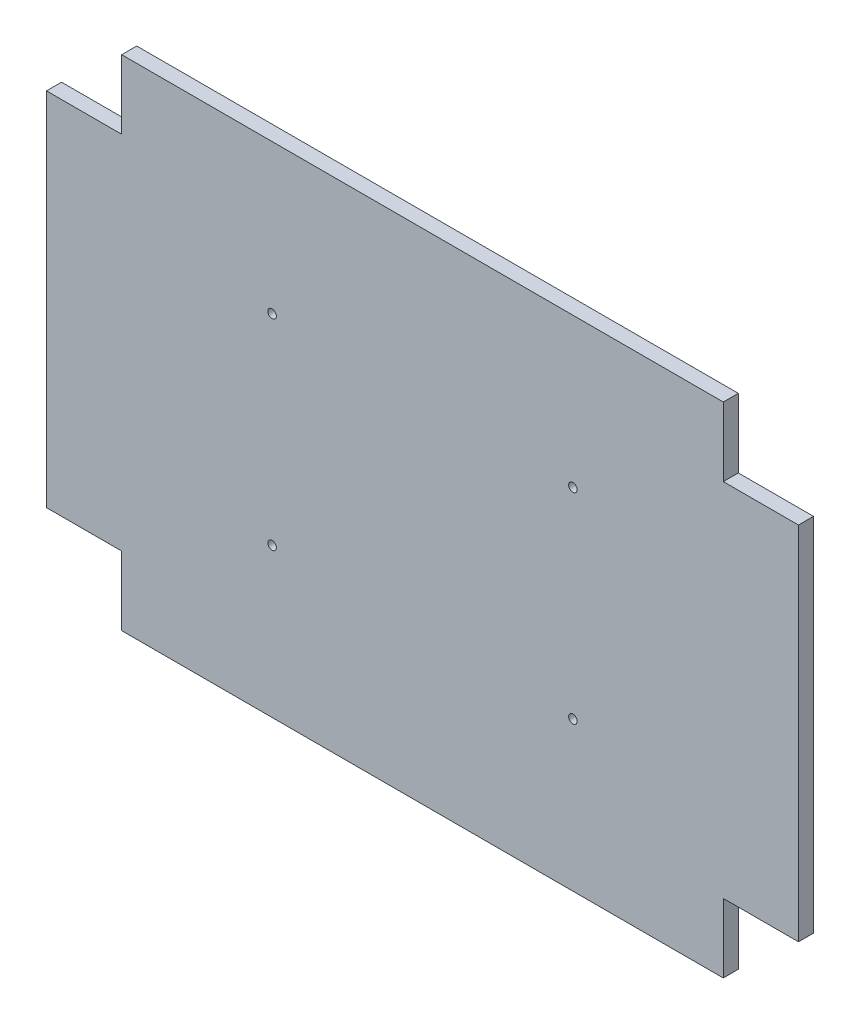
ISO-10303-21;
HEADER;
FILE_DESCRIPTION(('STEP AP214'),'2;1');
FILE_NAME('part.step','',(''),(''),'','','');
FILE_SCHEMA(('AUTOMOTIVE_DESIGN { 1 0 10303 214 1 1 1 1 }'));
ENDSEC;
DATA;
#1=APPLICATION_CONTEXT('core data for automotive mechanical design processes');
#2=APPLICATION_PROTOCOL_DEFINITION('international standard','automotive_design',2000,#1);
#3=PRODUCT_CONTEXT('',#1,'mechanical');
#4=PRODUCT('Part','Part','',(#3));
#5=PRODUCT_RELATED_PRODUCT_CATEGORY('part','',(#4));
#6=PRODUCT_DEFINITION_FORMATION('','',#4);
#7=PRODUCT_DEFINITION_CONTEXT('part definition',#1,'design');
#8=PRODUCT_DEFINITION('design','',#6,#7);
#9=PRODUCT_DEFINITION_SHAPE('','',#8);
#10=(LENGTH_UNIT() NAMED_UNIT(*) SI_UNIT(.MILLI.,.METRE.));
#11=(NAMED_UNIT(*) PLANE_ANGLE_UNIT() SI_UNIT($,.RADIAN.));
#12=(NAMED_UNIT(*) SI_UNIT($,.STERADIAN.) SOLID_ANGLE_UNIT());
#13=UNCERTAINTY_MEASURE_WITH_UNIT(LENGTH_MEASURE(1.E-05),#10,'distance_accuracy_value','');
#14=(GEOMETRIC_REPRESENTATION_CONTEXT(3) GLOBAL_UNCERTAINTY_ASSIGNED_CONTEXT((#13)) GLOBAL_UNIT_ASSIGNED_CONTEXT((#10,
#11,#12)) REPRESENTATION_CONTEXT('',''));
#15=CARTESIAN_POINT('',(0.,0.,0.));
#16=DIRECTION('',(0.,0.,1.));
#17=DIRECTION('',(1.,0.,0.));
#18=AXIS2_PLACEMENT_3D('',#15,#16,#17);
#19=CARTESIAN_POINT('',(-120.,99.5,6.));
#20=DIRECTION('',(1.,0.,0.));
#21=DIRECTION('',(0.,0.,-1.));
#22=AXIS2_PLACEMENT_3D('',#19,#20,#21);
#23=PLANE('',#22);
#24=DIRECTION('',(0.,-1.,0.));
#25=VECTOR('',#24,1.);
#26=CARTESIAN_POINT('',(-120.,99.5,0.));
#27=LINE('',#26,#25);
#28=CARTESIAN_POINT('',(-120.,99.5,0.));
#29=VERTEX_POINT('',#28);
#30=CARTESIAN_POINT('',(-120.,72.,0.));
#31=VERTEX_POINT('',#30);
#32=EDGE_CURVE('E153',#29,#31,#27,.T.);
#33=ORIENTED_EDGE('',*,*,#32,.T.);
#34=DIRECTION('',(0.,0.,-1.));
#35=VECTOR('',#34,1.);
#36=CARTESIAN_POINT('',(-120.,72.,6.));
#37=LINE('',#36,#35);
#38=CARTESIAN_POINT('',(-120.,72.,6.));
#39=VERTEX_POINT('',#38);
#40=EDGE_CURVE('E11',#39,#31,#37,.T.);
#41=ORIENTED_EDGE('',*,*,#40,.F.);
#42=DIRECTION('',(0.,-1.,0.));
#43=VECTOR('',#42,1.);
#44=CARTESIAN_POINT('',(-120.,99.5,6.));
#45=LINE('',#44,#43);
#46=CARTESIAN_POINT('',(-120.,99.5,6.));
#47=VERTEX_POINT('',#46);
#48=EDGE_CURVE('E176',#47,#39,#45,.T.);
#49=ORIENTED_EDGE('',*,*,#48,.F.);
#50=DIRECTION('',(0.,0.,-1.));
#51=VECTOR('',#50,1.);
#52=CARTESIAN_POINT('',(-120.,99.5,6.));
#53=LINE('',#52,#51);
#54=EDGE_CURVE('E149',#47,#29,#53,.T.);
#55=ORIENTED_EDGE('',*,*,#54,.T.);
#56=EDGE_LOOP('',(#33,#41,#49,#55));
#57=FACE_BOUND('',#56,.T.);
#58=ADVANCED_FACE('F33',(#57),#23,.F.);
#59=CARTESIAN_POINT('',(-150.,72.,6.));
#60=DIRECTION('',(0.,-1.,0.));
#61=DIRECTION('',(1.,0.,0.));
#62=AXIS2_PLACEMENT_3D('',#59,#60,#61);
#63=PLANE('',#62);
#64=DIRECTION('',(-1.,0.,0.));
#65=VECTOR('',#64,1.);
#66=CARTESIAN_POINT('',(-150.,72.,0.));
#67=LINE('',#66,#65);
#68=CARTESIAN_POINT('',(-150.,72.,0.));
#69=VERTEX_POINT('',#68);
#70=EDGE_CURVE('E156',#31,#69,#67,.T.);
#71=ORIENTED_EDGE('',*,*,#70,.T.);
#72=DIRECTION('',(0.,0.,-1.));
#73=VECTOR('',#72,1.);
#74=CARTESIAN_POINT('',(-150.,72.,6.));
#75=LINE('',#74,#73);
#76=CARTESIAN_POINT('',(-150.,72.,6.));
#77=VERTEX_POINT('',#76);
#78=EDGE_CURVE('E41',#77,#69,#75,.T.);
#79=ORIENTED_EDGE('',*,*,#78,.F.);
#80=DIRECTION('',(-1.,0.,0.));
#81=VECTOR('',#80,1.);
#82=CARTESIAN_POINT('',(-150.,72.,6.));
#83=LINE('',#82,#81);
#84=EDGE_CURVE('E104',#39,#77,#83,.T.);
#85=ORIENTED_EDGE('',*,*,#84,.F.);
#86=ORIENTED_EDGE('',*,*,#40,.T.);
#87=EDGE_LOOP('',(#71,#79,#85,#86));
#88=FACE_BOUND('',#87,.T.);
#89=ADVANCED_FACE('F255',(#88),#63,.F.);
#90=CARTESIAN_POINT('',(-150.,-72.,6.));
#91=DIRECTION('',(1.,0.,0.));
#92=DIRECTION('',(0.,0.,-1.));
#93=AXIS2_PLACEMENT_3D('',#90,#91,#92);
#94=PLANE('',#93);
#95=DIRECTION('',(0.,-1.,0.));
#96=VECTOR('',#95,1.);
#97=CARTESIAN_POINT('',(-150.,-72.,0.));
#98=LINE('',#97,#96);
#99=CARTESIAN_POINT('',(-150.,-72.,0.));
#100=VERTEX_POINT('',#99);
#101=EDGE_CURVE('E159',#69,#100,#98,.T.);
#102=ORIENTED_EDGE('',*,*,#101,.T.);
#103=DIRECTION('',(0.,0.,-1.));
#104=VECTOR('',#103,1.);
#105=CARTESIAN_POINT('',(-150.,-72.,6.));
#106=LINE('',#105,#104);
#107=CARTESIAN_POINT('',(-150.,-72.,6.));
#108=VERTEX_POINT('',#107);
#109=EDGE_CURVE('E195',#108,#100,#106,.T.);
#110=ORIENTED_EDGE('',*,*,#109,.F.);
#111=DIRECTION('',(0.,-1.,0.));
#112=VECTOR('',#111,1.);
#113=CARTESIAN_POINT('',(-150.,-72.,6.));
#114=LINE('',#113,#112);
#115=EDGE_CURVE('E203',#77,#108,#114,.T.);
#116=ORIENTED_EDGE('',*,*,#115,.F.);
#117=ORIENTED_EDGE('',*,*,#78,.T.);
#118=EDGE_LOOP('',(#102,#110,#116,#117));
#119=FACE_BOUND('',#118,.T.);
#120=ADVANCED_FACE('F201',(#119),#94,.F.);
#121=CARTESIAN_POINT('',(-150.,-72.,6.));
#122=DIRECTION('',(0.,1.,0.));
#123=DIRECTION('',(-1.,0.,0.));
#124=AXIS2_PLACEMENT_3D('',#121,#122,#123);
#125=PLANE('',#124);
#126=DIRECTION('',(1.,0.,0.));
#127=VECTOR('',#126,1.);
#128=CARTESIAN_POINT('',(-150.,-72.,0.));
#129=LINE('',#128,#127);
#130=CARTESIAN_POINT('',(-120.,-72.,0.));
#131=VERTEX_POINT('',#130);
#132=EDGE_CURVE('E161',#100,#131,#129,.T.);
#133=ORIENTED_EDGE('',*,*,#132,.T.);
#134=DIRECTION('',(0.,0.,-1.));
#135=VECTOR('',#134,1.);
#136=CARTESIAN_POINT('',(-120.,-72.,6.));
#137=LINE('',#136,#135);
#138=CARTESIAN_POINT('',(-120.,-72.,6.));
#139=VERTEX_POINT('',#138);
#140=EDGE_CURVE('E192',#139,#131,#137,.T.);
#141=ORIENTED_EDGE('',*,*,#140,.F.);
#142=DIRECTION('',(1.,0.,0.));
#143=VECTOR('',#142,1.);
#144=CARTESIAN_POINT('',(-150.,-72.,6.));
#145=LINE('',#144,#143);
#146=EDGE_CURVE('E221',#108,#139,#145,.T.);
#147=ORIENTED_EDGE('',*,*,#146,.F.);
#148=ORIENTED_EDGE('',*,*,#109,.T.);
#149=EDGE_LOOP('',(#133,#141,#147,#148));
#150=FACE_BOUND('',#149,.T.);
#151=ADVANCED_FACE('F212',(#150),#125,.F.);
#152=CARTESIAN_POINT('',(-120.,-99.5,6.));
#153=DIRECTION('',(1.,0.,0.));
#154=DIRECTION('',(0.,1.,0.));
#155=AXIS2_PLACEMENT_3D('',#152,#153,#154);
#156=PLANE('',#155);
#157=DIRECTION('',(0.,-1.,0.));
#158=VECTOR('',#157,1.);
#159=CARTESIAN_POINT('',(-120.,-99.5,0.));
#160=LINE('',#159,#158);
#161=CARTESIAN_POINT('',(-120.,-99.5,0.));
#162=VERTEX_POINT('',#161);
#163=EDGE_CURVE('E163',#131,#162,#160,.T.);
#164=ORIENTED_EDGE('',*,*,#163,.T.);
#165=DIRECTION('',(0.,0.,-1.));
#166=VECTOR('',#165,1.);
#167=CARTESIAN_POINT('',(-120.,-99.5,6.));
#168=LINE('',#167,#166);
#169=CARTESIAN_POINT('',(-120.,-99.5,6.));
#170=VERTEX_POINT('',#169);
#171=EDGE_CURVE('E189',#170,#162,#168,.T.);
#172=ORIENTED_EDGE('',*,*,#171,.F.);
#173=DIRECTION('',(0.,-1.,0.));
#174=VECTOR('',#173,1.);
#175=CARTESIAN_POINT('',(-120.,-99.5,6.));
#176=LINE('',#175,#174);
#177=EDGE_CURVE('E218',#139,#170,#176,.T.);
#178=ORIENTED_EDGE('',*,*,#177,.F.);
#179=ORIENTED_EDGE('',*,*,#140,.T.);
#180=EDGE_LOOP('',(#164,#172,#178,#179));
#181=FACE_BOUND('',#180,.T.);
#182=ADVANCED_FACE('F216',(#181),#156,.F.);
#183=CARTESIAN_POINT('',(-120.,-99.5,6.));
#184=DIRECTION('',(0.,1.,0.));
#185=DIRECTION('',(0.,0.,1.));
#186=AXIS2_PLACEMENT_3D('',#183,#184,#185);
#187=PLANE('',#186);
#188=DIRECTION('',(1.,0.,0.));
#189=VECTOR('',#188,1.);
#190=CARTESIAN_POINT('',(-120.,-99.5,0.));
#191=LINE('',#190,#189);
#192=CARTESIAN_POINT('',(120.,-99.5,0.));
#193=VERTEX_POINT('',#192);
#194=EDGE_CURVE('E165',#162,#193,#191,.T.);
#195=ORIENTED_EDGE('',*,*,#194,.T.);
#196=DIRECTION('',(0.,0.,-1.));
#197=VECTOR('',#196,1.);
#198=CARTESIAN_POINT('',(120.,-99.5,6.));
#199=LINE('',#198,#197);
#200=CARTESIAN_POINT('',(120.,-99.5,6.));
#201=VERTEX_POINT('',#200);
#202=EDGE_CURVE('E186',#201,#193,#199,.T.);
#203=ORIENTED_EDGE('',*,*,#202,.F.);
#204=DIRECTION('',(1.,0.,0.));
#205=VECTOR('',#204,1.);
#206=CARTESIAN_POINT('',(-120.,-99.5,6.));
#207=LINE('',#206,#205);
#208=EDGE_CURVE('E220',#170,#201,#207,.T.);
#209=ORIENTED_EDGE('',*,*,#208,.F.);
#210=ORIENTED_EDGE('',*,*,#171,.T.);
#211=EDGE_LOOP('',(#195,#203,#209,#210));
#212=FACE_BOUND('',#211,.T.);
#213=ADVANCED_FACE('F268',(#212),#187,.F.);
#214=CARTESIAN_POINT('',(120.,-99.5,6.));
#215=DIRECTION('',(-1.,0.,0.));
#216=DIRECTION('',(0.,0.,1.));
#217=AXIS2_PLACEMENT_3D('',#214,#215,#216);
#218=PLANE('',#217);
#219=DIRECTION('',(0.,1.,0.));
#220=VECTOR('',#219,1.);
#221=CARTESIAN_POINT('',(120.,-99.5,0.));
#222=LINE('',#221,#220);
#223=CARTESIAN_POINT('',(120.,-72.0000000000001,0.));
#224=VERTEX_POINT('',#223);
#225=EDGE_CURVE('E167',#193,#224,#222,.T.);
#226=ORIENTED_EDGE('',*,*,#225,.T.);
#227=DIRECTION('',(0.,0.,-1.));
#228=VECTOR('',#227,1.);
#229=CARTESIAN_POINT('',(120.,-72.0000000000001,6.));
#230=LINE('',#229,#228);
#231=CARTESIAN_POINT('',(120.,-72.0000000000001,6.));
#232=VERTEX_POINT('',#231);
#233=EDGE_CURVE('E183',#232,#224,#230,.T.);
#234=ORIENTED_EDGE('',*,*,#233,.F.);
#235=DIRECTION('',(0.,1.,0.));
#236=VECTOR('',#235,1.);
#237=CARTESIAN_POINT('',(120.,-99.5,6.));
#238=LINE('',#237,#236);
#239=EDGE_CURVE('E223',#201,#232,#238,.T.);
#240=ORIENTED_EDGE('',*,*,#239,.F.);
#241=ORIENTED_EDGE('',*,*,#202,.T.);
#242=EDGE_LOOP('',(#226,#234,#240,#241));
#243=FACE_BOUND('',#242,.T.);
#244=ADVANCED_FACE('F271',(#243),#218,.F.);
#245=CARTESIAN_POINT('',(150.,-72.0000000000001,6.));
#246=DIRECTION('',(0.,1.,0.));
#247=DIRECTION('',(0.,0.,1.));
#248=AXIS2_PLACEMENT_3D('',#245,#246,#247);
#249=PLANE('',#248);
#250=DIRECTION('',(1.,0.,0.));
#251=VECTOR('',#250,1.);
#252=CARTESIAN_POINT('',(150.,-72.0000000000001,0.));
#253=LINE('',#252,#251);
#254=CARTESIAN_POINT('',(150.,-72.0000000000001,0.));
#255=VERTEX_POINT('',#254);
#256=EDGE_CURVE('E169',#224,#255,#253,.T.);
#257=ORIENTED_EDGE('',*,*,#256,.T.);
#258=DIRECTION('',(0.,0.,-1.));
#259=VECTOR('',#258,1.);
#260=CARTESIAN_POINT('',(150.,-72.0000000000001,6.));
#261=LINE('',#260,#259);
#262=CARTESIAN_POINT('',(150.,-72.0000000000001,6.));
#263=VERTEX_POINT('',#262);
#264=EDGE_CURVE('E180',#263,#255,#261,.T.);
#265=ORIENTED_EDGE('',*,*,#264,.F.);
#266=DIRECTION('',(1.,0.,0.));
#267=VECTOR('',#266,1.);
#268=CARTESIAN_POINT('',(150.,-72.0000000000001,6.));
#269=LINE('',#268,#267);
#270=EDGE_CURVE('E229',#232,#263,#269,.T.);
#271=ORIENTED_EDGE('',*,*,#270,.F.);
#272=ORIENTED_EDGE('',*,*,#233,.T.);
#273=EDGE_LOOP('',(#257,#265,#271,#272));
#274=FACE_BOUND('',#273,.T.);
#275=ADVANCED_FACE('F235',(#274),#249,.F.);
#276=CARTESIAN_POINT('',(150.,-72.0000000000001,6.));
#277=DIRECTION('',(-1.,0.,0.));
#278=DIRECTION('',(0.,0.,1.));
#279=AXIS2_PLACEMENT_3D('',#276,#277,#278);
#280=PLANE('',#279);
#281=DIRECTION('',(0.,1.,0.));
#282=VECTOR('',#281,1.);
#283=CARTESIAN_POINT('',(150.,-72.0000000000001,0.));
#284=LINE('',#283,#282);
#285=CARTESIAN_POINT('',(150.,72.,0.));
#286=VERTEX_POINT('',#285);
#287=EDGE_CURVE('E171',#255,#286,#284,.T.);
#288=ORIENTED_EDGE('',*,*,#287,.T.);
#289=DIRECTION('',(0.,0.,-1.));
#290=VECTOR('',#289,1.);
#291=CARTESIAN_POINT('',(150.,72.,6.));
#292=LINE('',#291,#290);
#293=CARTESIAN_POINT('',(150.,72.,6.));
#294=VERTEX_POINT('',#293);
#295=EDGE_CURVE('E144',#294,#286,#292,.T.);
#296=ORIENTED_EDGE('',*,*,#295,.F.);
#297=DIRECTION('',(0.,1.,0.));
#298=VECTOR('',#297,1.);
#299=CARTESIAN_POINT('',(150.,-72.0000000000001,6.));
#300=LINE('',#299,#298);
#301=EDGE_CURVE('E135',#263,#294,#300,.T.);
#302=ORIENTED_EDGE('',*,*,#301,.F.);
#303=ORIENTED_EDGE('',*,*,#264,.T.);
#304=EDGE_LOOP('',(#288,#296,#302,#303));
#305=FACE_BOUND('',#304,.T.);
#306=ADVANCED_FACE('F239',(#305),#280,.F.);
#307=CARTESIAN_POINT('',(120.,72.,6.));
#308=DIRECTION('',(0.,-1.,0.));
#309=DIRECTION('',(1.,0.,0.));
#310=AXIS2_PLACEMENT_3D('',#307,#308,#309);
#311=PLANE('',#310);
#312=DIRECTION('',(-1.,0.,0.));
#313=VECTOR('',#312,1.);
#314=CARTESIAN_POINT('',(120.,72.,0.));
#315=LINE('',#314,#313);
#316=CARTESIAN_POINT('',(120.,72.,0.));
#317=VERTEX_POINT('',#316);
#318=EDGE_CURVE('E143',#286,#317,#315,.T.);
#319=ORIENTED_EDGE('',*,*,#318,.T.);
#320=DIRECTION('',(0.,0.,-1.));
#321=VECTOR('',#320,1.);
#322=CARTESIAN_POINT('',(120.,72.,6.));
#323=LINE('',#322,#321);
#324=CARTESIAN_POINT('',(120.,72.,6.));
#325=VERTEX_POINT('',#324);
#326=EDGE_CURVE('E140',#325,#317,#323,.T.);
#327=ORIENTED_EDGE('',*,*,#326,.F.);
#328=DIRECTION('',(-1.,0.,0.));
#329=VECTOR('',#328,1.);
#330=CARTESIAN_POINT('',(120.,72.,6.));
#331=LINE('',#330,#329);
#332=EDGE_CURVE('E129',#294,#325,#331,.T.);
#333=ORIENTED_EDGE('',*,*,#332,.F.);
#334=ORIENTED_EDGE('',*,*,#295,.T.);
#335=EDGE_LOOP('',(#319,#327,#333,#334));
#336=FACE_BOUND('',#335,.T.);
#337=ADVANCED_FACE('F141',(#336),#311,.F.);
#338=CARTESIAN_POINT('',(120.,99.5,6.));
#339=DIRECTION('',(-1.,0.,0.));
#340=DIRECTION('',(0.,-1.,0.));
#341=AXIS2_PLACEMENT_3D('',#338,#339,#340);
#342=PLANE('',#341);
#343=DIRECTION('',(0.,1.,0.));
#344=VECTOR('',#343,1.);
#345=CARTESIAN_POINT('',(120.,99.5,0.));
#346=LINE('',#345,#344);
#347=CARTESIAN_POINT('',(120.,99.5,0.));
#348=VERTEX_POINT('',#347);
#349=EDGE_CURVE('E90',#317,#348,#346,.T.);
#350=ORIENTED_EDGE('',*,*,#349,.T.);
#351=DIRECTION('',(0.,0.,-1.));
#352=VECTOR('',#351,1.);
#353=CARTESIAN_POINT('',(120.,99.5,6.));
#354=LINE('',#353,#352);
#355=CARTESIAN_POINT('',(120.,99.5,6.));
#356=VERTEX_POINT('',#355);
#357=EDGE_CURVE('E145',#356,#348,#354,.T.);
#358=ORIENTED_EDGE('',*,*,#357,.F.);
#359=DIRECTION('',(0.,1.,0.));
#360=VECTOR('',#359,1.);
#361=CARTESIAN_POINT('',(120.,99.5,6.));
#362=LINE('',#361,#360);
#363=EDGE_CURVE('E133',#325,#356,#362,.T.);
#364=ORIENTED_EDGE('',*,*,#363,.F.);
#365=ORIENTED_EDGE('',*,*,#326,.T.);
#366=EDGE_LOOP('',(#350,#358,#364,#365));
#367=FACE_BOUND('',#366,.T.);
#368=ADVANCED_FACE('F147',(#367),#342,.F.);
#369=CARTESIAN_POINT('',(-120.,99.5,6.));
#370=DIRECTION('',(0.,-1.,0.));
#371=DIRECTION('',(0.,0.,-1.));
#372=AXIS2_PLACEMENT_3D('',#369,#370,#371);
#373=PLANE('',#372);
#374=DIRECTION('',(-1.,0.,0.));
#375=VECTOR('',#374,1.);
#376=CARTESIAN_POINT('',(-120.,99.5,0.));
#377=LINE('',#376,#375);
#378=EDGE_CURVE('E96',#348,#29,#377,.T.);
#379=ORIENTED_EDGE('',*,*,#378,.T.);
#380=ORIENTED_EDGE('',*,*,#54,.F.);
#381=DIRECTION('',(-1.,0.,0.));
#382=VECTOR('',#381,1.);
#383=CARTESIAN_POINT('',(-120.,99.5,6.));
#384=LINE('',#383,#382);
#385=EDGE_CURVE('E49',#356,#47,#384,.T.);
#386=ORIENTED_EDGE('',*,*,#385,.F.);
#387=ORIENTED_EDGE('',*,*,#357,.T.);
#388=EDGE_LOOP('',(#379,#380,#386,#387));
#389=FACE_BOUND('',#388,.T.);
#390=ADVANCED_FACE('F243',(#389),#373,.F.);
#391=CARTESIAN_POINT('',(0.,0.,6.));
#392=DIRECTION('',(0.,0.,1.));
#393=DIRECTION('',(1.,0.,0.));
#394=AXIS2_PLACEMENT_3D('',#391,#392,#393);
#395=PLANE('',#394);
#396=CARTESIAN_POINT('',(-60.,40.,6.));
#397=DIRECTION('',(0.,0.,1.));
#398=DIRECTION('',(1.,0.,0.));
#399=AXIS2_PLACEMENT_3D('',#396,#397,#398);
#400=CIRCLE('',#399,1.7);
#401=CARTESIAN_POINT('',(-58.3,40.,6.));
#402=VERTEX_POINT('',#401);
#403=EDGE_CURVE('E357',#402,#402,#400,.T.);
#404=ORIENTED_EDGE('',*,*,#403,.F.);
#405=EDGE_LOOP('',(#404));
#406=FACE_BOUND('',#405,.T.);
#407=CARTESIAN_POINT('',(-60.,-40.,6.));
#408=DIRECTION('',(0.,0.,1.));
#409=DIRECTION('',(1.,0.,0.));
#410=AXIS2_PLACEMENT_3D('',#407,#408,#409);
#411=CIRCLE('',#410,1.7);
#412=CARTESIAN_POINT('',(-58.3,-40.,6.));
#413=VERTEX_POINT('',#412);
#414=EDGE_CURVE('E359',#413,#413,#411,.T.);
#415=ORIENTED_EDGE('',*,*,#414,.F.);
#416=EDGE_LOOP('',(#415));
#417=FACE_BOUND('',#416,.T.);
#418=CARTESIAN_POINT('',(60.,-40.,6.));
#419=DIRECTION('',(0.,0.,1.));
#420=DIRECTION('',(1.,0.,0.));
#421=AXIS2_PLACEMENT_3D('',#418,#419,#420);
#422=CIRCLE('',#421,1.7);
#423=CARTESIAN_POINT('',(61.7,-40.,6.));
#424=VERTEX_POINT('',#423);
#425=EDGE_CURVE('E367',#424,#424,#422,.T.);
#426=ORIENTED_EDGE('',*,*,#425,.F.);
#427=EDGE_LOOP('',(#426));
#428=FACE_BOUND('',#427,.T.);
#429=CARTESIAN_POINT('',(60.,40.,6.));
#430=DIRECTION('',(0.,0.,1.));
#431=DIRECTION('',(1.,0.,0.));
#432=AXIS2_PLACEMENT_3D('',#429,#430,#431);
#433=CIRCLE('',#432,1.7);
#434=CARTESIAN_POINT('',(61.7,40.,6.));
#435=VERTEX_POINT('',#434);
#436=EDGE_CURVE('E373',#435,#435,#433,.T.);
#437=ORIENTED_EDGE('',*,*,#436,.F.);
#438=EDGE_LOOP('',(#437));
#439=FACE_BOUND('',#438,.T.);
#440=ORIENTED_EDGE('',*,*,#48,.T.);
#441=ORIENTED_EDGE('',*,*,#84,.T.);
#442=ORIENTED_EDGE('',*,*,#115,.T.);
#443=ORIENTED_EDGE('',*,*,#146,.T.);
#444=ORIENTED_EDGE('',*,*,#177,.T.);
#445=ORIENTED_EDGE('',*,*,#208,.T.);
#446=ORIENTED_EDGE('',*,*,#239,.T.);
#447=ORIENTED_EDGE('',*,*,#270,.T.);
#448=ORIENTED_EDGE('',*,*,#301,.T.);
#449=ORIENTED_EDGE('',*,*,#332,.T.);
#450=ORIENTED_EDGE('',*,*,#363,.T.);
#451=ORIENTED_EDGE('',*,*,#385,.T.);
#452=EDGE_LOOP('',(#440,#441,#442,#443,#444,#445,#446,#447,#448,#449,#450,#451));
#453=FACE_BOUND('',#452,.T.);
#454=ADVANCED_FACE('F131',(#406,#417,#428,#439,#453),#395,.T.);
#455=CARTESIAN_POINT('',(0.,0.,0.));
#456=DIRECTION('',(0.,0.,1.));
#457=DIRECTION('',(1.,0.,0.));
#458=AXIS2_PLACEMENT_3D('',#455,#456,#457);
#459=PLANE('',#458);
#460=CARTESIAN_POINT('',(-60.,40.,0.));
#461=DIRECTION('',(0.,0.,1.));
#462=DIRECTION('',(1.,0.,0.));
#463=AXIS2_PLACEMENT_3D('',#460,#461,#462);
#464=CIRCLE('',#463,1.7);
#465=CARTESIAN_POINT('',(-58.3,40.,0.));
#466=VERTEX_POINT('',#465);
#467=EDGE_CURVE('E354',#466,#466,#464,.T.);
#468=ORIENTED_EDGE('',*,*,#467,.T.);
#469=EDGE_LOOP('',(#468));
#470=FACE_BOUND('',#469,.T.);
#471=CARTESIAN_POINT('',(-60.,-40.,0.));
#472=DIRECTION('',(0.,0.,1.));
#473=DIRECTION('',(1.,0.,0.));
#474=AXIS2_PLACEMENT_3D('',#471,#472,#473);
#475=CIRCLE('',#474,1.7);
#476=CARTESIAN_POINT('',(-58.3,-40.,0.));
#477=VERTEX_POINT('',#476);
#478=EDGE_CURVE('E364',#477,#477,#475,.T.);
#479=ORIENTED_EDGE('',*,*,#478,.T.);
#480=EDGE_LOOP('',(#479));
#481=FACE_BOUND('',#480,.T.);
#482=CARTESIAN_POINT('',(60.,-40.,0.));
#483=DIRECTION('',(0.,0.,1.));
#484=DIRECTION('',(1.,0.,0.));
#485=AXIS2_PLACEMENT_3D('',#482,#483,#484);
#486=CIRCLE('',#485,1.7);
#487=CARTESIAN_POINT('',(61.7,-40.,0.));
#488=VERTEX_POINT('',#487);
#489=EDGE_CURVE('E370',#488,#488,#486,.T.);
#490=ORIENTED_EDGE('',*,*,#489,.T.);
#491=EDGE_LOOP('',(#490));
#492=FACE_BOUND('',#491,.T.);
#493=CARTESIAN_POINT('',(60.,40.,0.));
#494=DIRECTION('',(0.,0.,1.));
#495=DIRECTION('',(1.,0.,0.));
#496=AXIS2_PLACEMENT_3D('',#493,#494,#495);
#497=CIRCLE('',#496,1.7);
#498=CARTESIAN_POINT('',(61.7,40.,0.));
#499=VERTEX_POINT('',#498);
#500=EDGE_CURVE('E157',#499,#499,#497,.T.);
#501=ORIENTED_EDGE('',*,*,#500,.T.);
#502=EDGE_LOOP('',(#501));
#503=FACE_BOUND('',#502,.T.);
#504=ORIENTED_EDGE('',*,*,#32,.F.);
#505=ORIENTED_EDGE('',*,*,#378,.F.);
#506=ORIENTED_EDGE('',*,*,#349,.F.);
#507=ORIENTED_EDGE('',*,*,#318,.F.);
#508=ORIENTED_EDGE('',*,*,#287,.F.);
#509=ORIENTED_EDGE('',*,*,#256,.F.);
#510=ORIENTED_EDGE('',*,*,#225,.F.);
#511=ORIENTED_EDGE('',*,*,#194,.F.);
#512=ORIENTED_EDGE('',*,*,#163,.F.);
#513=ORIENTED_EDGE('',*,*,#132,.F.);
#514=ORIENTED_EDGE('',*,*,#101,.F.);
#515=ORIENTED_EDGE('',*,*,#70,.F.);
#516=EDGE_LOOP('',(#504,#505,#506,#507,#508,#509,#510,#511,#512,#513,#514,#515));
#517=FACE_BOUND('',#516,.T.);
#518=ADVANCED_FACE('F207',(#470,#481,#492,#503,#517),#459,.F.);
#519=CARTESIAN_POINT('',(60.,40.,6.));
#520=DIRECTION('',(0.,0.,1.));
#521=DIRECTION('',(1.,0.,0.));
#522=AXIS2_PLACEMENT_3D('',#519,#520,#521);
#523=CYLINDRICAL_SURFACE('',#522,1.7);
#524=ORIENTED_EDGE('',*,*,#500,.F.);
#525=EDGE_LOOP('',(#524));
#526=FACE_BOUND('',#525,.T.);
#527=ORIENTED_EDGE('',*,*,#436,.T.);
#528=EDGE_LOOP('',(#527));
#529=FACE_BOUND('',#528,.T.);
#530=ADVANCED_FACE('F308',(#526,#529),#523,.F.);
#531=CARTESIAN_POINT('',(60.,-40.,6.));
#532=DIRECTION('',(0.,0.,1.));
#533=DIRECTION('',(1.,0.,0.));
#534=AXIS2_PLACEMENT_3D('',#531,#532,#533);
#535=CYLINDRICAL_SURFACE('',#534,1.7);
#536=ORIENTED_EDGE('',*,*,#489,.F.);
#537=EDGE_LOOP('',(#536));
#538=FACE_BOUND('',#537,.T.);
#539=ORIENTED_EDGE('',*,*,#425,.T.);
#540=EDGE_LOOP('',(#539));
#541=FACE_BOUND('',#540,.T.);
#542=ADVANCED_FACE('F317',(#538,#541),#535,.F.);
#543=CARTESIAN_POINT('',(-60.,-40.,6.));
#544=DIRECTION('',(0.,0.,1.));
#545=DIRECTION('',(1.,0.,0.));
#546=AXIS2_PLACEMENT_3D('',#543,#544,#545);
#547=CYLINDRICAL_SURFACE('',#546,1.7);
#548=ORIENTED_EDGE('',*,*,#478,.F.);
#549=EDGE_LOOP('',(#548));
#550=FACE_BOUND('',#549,.T.);
#551=ORIENTED_EDGE('',*,*,#414,.T.);
#552=EDGE_LOOP('',(#551));
#553=FACE_BOUND('',#552,.T.);
#554=ADVANCED_FACE('F327',(#550,#553),#547,.F.);
#555=CARTESIAN_POINT('',(-60.,40.,6.));
#556=DIRECTION('',(0.,0.,1.));
#557=DIRECTION('',(1.,0.,0.));
#558=AXIS2_PLACEMENT_3D('',#555,#556,#557);
#559=CYLINDRICAL_SURFACE('',#558,1.7);
#560=ORIENTED_EDGE('',*,*,#467,.F.);
#561=EDGE_LOOP('',(#560));
#562=FACE_BOUND('',#561,.T.);
#563=ORIENTED_EDGE('',*,*,#403,.T.);
#564=EDGE_LOOP('',(#563));
#565=FACE_BOUND('',#564,.T.);
#566=ADVANCED_FACE('F337',(#562,#565),#559,.F.);
#567=CLOSED_SHELL('',(#58,#89,#120,#151,#182,#213,#244,#275,#306,#337,#368,#390,#454,#518,#530,
#542,#554,#566));
#568=MANIFOLD_SOLID_BREP('B2',#567);
#569=ADVANCED_BREP_SHAPE_REPRESENTATION('',(#18,#568),#14);
#570=SHAPE_DEFINITION_REPRESENTATION(#9,#569);
ENDSEC;
END-ISO-10303-21;
